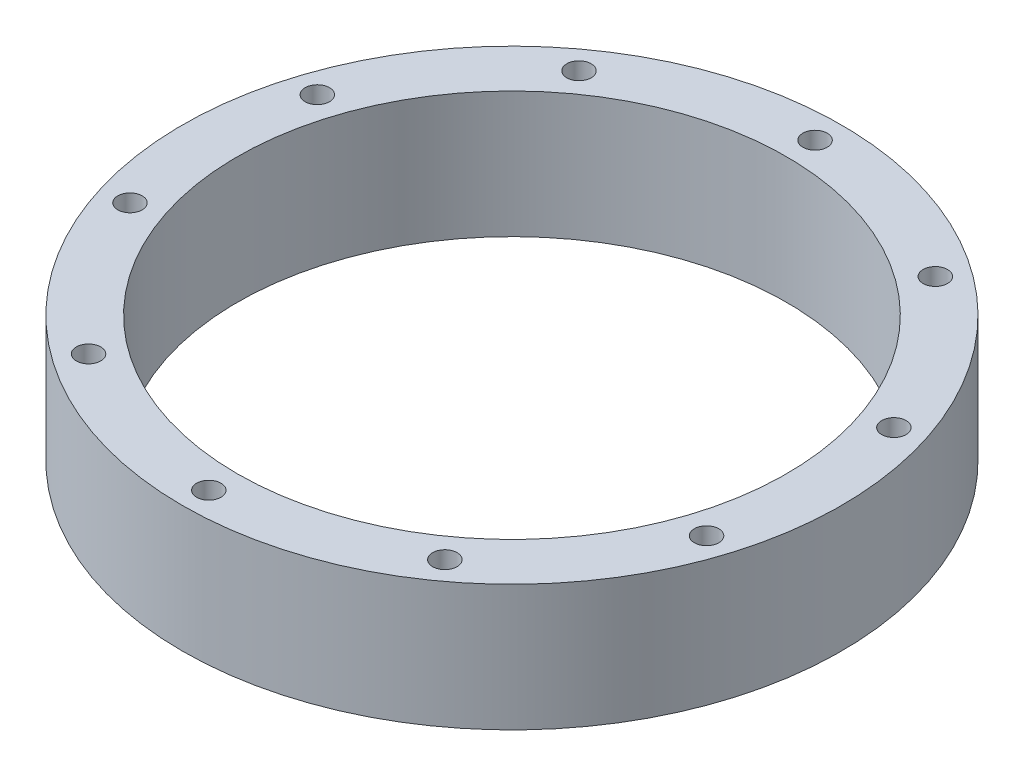
ISO-10303-21;
HEADER;
FILE_DESCRIPTION(('STEP AP214'),'2;1');
FILE_NAME('part.step','',(''),(''),'','','');
FILE_SCHEMA(('AUTOMOTIVE_DESIGN { 1 0 10303 214 1 1 1 1 }'));
ENDSEC;
DATA;
#1=APPLICATION_CONTEXT('core data for automotive mechanical design processes');
#2=APPLICATION_PROTOCOL_DEFINITION('international standard','automotive_design',2000,#1);
#3=PRODUCT_CONTEXT('',#1,'mechanical');
#4=PRODUCT('Part','Part','',(#3));
#5=PRODUCT_RELATED_PRODUCT_CATEGORY('part','',(#4));
#6=PRODUCT_DEFINITION_FORMATION('','',#4);
#7=PRODUCT_DEFINITION_CONTEXT('part definition',#1,'design');
#8=PRODUCT_DEFINITION('design','',#6,#7);
#9=PRODUCT_DEFINITION_SHAPE('','',#8);
#10=(LENGTH_UNIT() NAMED_UNIT(*) SI_UNIT(.MILLI.,.METRE.));
#11=(NAMED_UNIT(*) PLANE_ANGLE_UNIT() SI_UNIT($,.RADIAN.));
#12=(NAMED_UNIT(*) SI_UNIT($,.STERADIAN.) SOLID_ANGLE_UNIT());
#13=UNCERTAINTY_MEASURE_WITH_UNIT(LENGTH_MEASURE(1.E-05),#10,'distance_accuracy_value','');
#14=(GEOMETRIC_REPRESENTATION_CONTEXT(3) GLOBAL_UNCERTAINTY_ASSIGNED_CONTEXT((#13)) GLOBAL_UNIT_ASSIGNED_CONTEXT((#10,
#11,#12)) REPRESENTATION_CONTEXT('',''));
#15=CARTESIAN_POINT('',(0.,0.,0.));
#16=DIRECTION('',(0.,0.,1.));
#17=DIRECTION('',(1.,0.,0.));
#18=AXIS2_PLACEMENT_3D('',#15,#16,#17);
#19=CARTESIAN_POINT('',(0.,15.5,0.));
#20=DIRECTION('',(0.,1.,0.));
#21=DIRECTION('',(0.,0.,1.));
#22=AXIS2_PLACEMENT_3D('',#19,#20,#21);
#23=PLANE('',#22);
#24=CARTESIAN_POINT('',(-21.8950006478949,15.5,-30.1358830404666));
#25=DIRECTION('',(0.,1.,0.));
#26=DIRECTION('',(0.,0.,1.));
#27=AXIS2_PLACEMENT_3D('',#24,#25,#26);
#28=CIRCLE('',#27,1.50000000000077);
#29=CARTESIAN_POINT('',(-21.8950006478949,15.5,-28.6358830404658));
#30=VERTEX_POINT('',#29);
#31=EDGE_CURVE('E99',#30,#30,#28,.T.);
#32=ORIENTED_EDGE('',*,*,#31,.F.);
#33=EDGE_LOOP('',(#32));
#34=FACE_BOUND('',#33,.T.);
#35=CARTESIAN_POINT('',(-35.4268552319947,15.5,11.5108830404676));
#36=DIRECTION('',(0.,1.,0.));
#37=DIRECTION('',(0.,0.,1.));
#38=AXIS2_PLACEMENT_3D('',#35,#36,#37);
#39=CIRCLE('',#38,1.50000000000084);
#40=CARTESIAN_POINT('',(-35.4268552319947,15.5,13.0108830404684));
#41=VERTEX_POINT('',#40);
#42=EDGE_CURVE('E87',#41,#41,#39,.T.);
#43=ORIENTED_EDGE('',*,*,#42,.F.);
#44=EDGE_LOOP('',(#43));
#45=FACE_BOUND('',#44,.T.);
#46=CARTESIAN_POINT('',(0.,15.5,37.25));
#47=DIRECTION('',(0.,1.,0.));
#48=DIRECTION('',(0.,0.,1.));
#49=AXIS2_PLACEMENT_3D('',#46,#47,#48);
#50=CIRCLE('',#49,1.50000000000025);
#51=CARTESIAN_POINT('',(0.,15.5,38.7500000000002));
#52=VERTEX_POINT('',#51);
#53=EDGE_CURVE('E75',#52,#52,#50,.T.);
#54=ORIENTED_EDGE('',*,*,#53,.F.);
#55=EDGE_LOOP('',(#54));
#56=FACE_BOUND('',#55,.T.);
#57=CARTESIAN_POINT('',(35.4268552319951,15.5,11.5108830404673));
#58=DIRECTION('',(0.,1.,0.));
#59=DIRECTION('',(0.,0.,1.));
#60=AXIS2_PLACEMENT_3D('',#57,#58,#59);
#61=CIRCLE('',#60,1.49999999999969);
#62=CARTESIAN_POINT('',(35.4268552319951,15.5,13.010883040467));
#63=VERTEX_POINT('',#62);
#64=EDGE_CURVE('E63',#63,#63,#61,.T.);
#65=ORIENTED_EDGE('',*,*,#64,.F.);
#66=EDGE_LOOP('',(#65));
#67=FACE_BOUND('',#66,.T.);
#68=CARTESIAN_POINT('',(21.8950006478949,15.5,-30.1358830404668));
#69=DIRECTION('',(0.,1.,0.));
#70=DIRECTION('',(0.,0.,1.));
#71=AXIS2_PLACEMENT_3D('',#68,#69,#70);
#72=CIRCLE('',#71,1.49999999999974);
#73=CARTESIAN_POINT('',(21.8950006478949,15.5,-28.635883040467));
#74=VERTEX_POINT('',#73);
#75=EDGE_CURVE('E51',#74,#74,#72,.T.);
#76=ORIENTED_EDGE('',*,*,#75,.F.);
#77=EDGE_LOOP('',(#76));
#78=FACE_BOUND('',#77,.T.);
#79=CARTESIAN_POINT('',(0.,15.5,0.));
#80=DIRECTION('',(0.,1.,0.));
#81=DIRECTION('',(0.,0.,1.));
#82=AXIS2_PLACEMENT_3D('',#79,#80,#81);
#83=CIRCLE('',#82,40.5);
#84=CARTESIAN_POINT('',(0.,15.5,40.5));
#85=VERTEX_POINT('',#84);
#86=EDGE_CURVE('E10',#85,#85,#83,.T.);
#87=ORIENTED_EDGE('',*,*,#86,.T.);
#88=EDGE_LOOP('',(#87));
#89=FACE_BOUND('',#88,.T.);
#90=CARTESIAN_POINT('',(0.,15.5,-37.25));
#91=DIRECTION('',(0.,1.,0.));
#92=DIRECTION('',(0.,0.,1.));
#93=AXIS2_PLACEMENT_3D('',#90,#91,#92);
#94=CIRCLE('',#93,1.5);
#95=CARTESIAN_POINT('',(0.,15.5,-35.75));
#96=VERTEX_POINT('',#95);
#97=EDGE_CURVE('E46',#96,#96,#94,.T.);
#98=ORIENTED_EDGE('',*,*,#97,.F.);
#99=EDGE_LOOP('',(#98));
#100=FACE_BOUND('',#99,.T.);
#101=CARTESIAN_POINT('',(35.426855231995,15.5,-11.5108830404666));
#102=DIRECTION('',(0.,1.,0.));
#103=DIRECTION('',(0.,0.,1.));
#104=AXIS2_PLACEMENT_3D('',#101,#102,#103);
#105=CIRCLE('',#104,1.49999999999962);
#106=CARTESIAN_POINT('',(35.426855231995,15.5,-10.010883040467));
#107=VERTEX_POINT('',#106);
#108=EDGE_CURVE('E57',#107,#107,#105,.T.);
#109=ORIENTED_EDGE('',*,*,#108,.F.);
#110=EDGE_LOOP('',(#109));
#111=FACE_BOUND('',#110,.T.);
#112=CARTESIAN_POINT('',(21.8950006478946,15.5,30.1358830404668));
#113=DIRECTION('',(0.,1.,0.));
#114=DIRECTION('',(0.,0.,1.));
#115=AXIS2_PLACEMENT_3D('',#112,#113,#114);
#116=CIRCLE('',#115,1.50000000000021);
#117=CARTESIAN_POINT('',(21.8950006478946,15.5,31.635883040467));
#118=VERTEX_POINT('',#117);
#119=EDGE_CURVE('E69',#118,#118,#116,.T.);
#120=ORIENTED_EDGE('',*,*,#119,.F.);
#121=EDGE_LOOP('',(#120));
#122=FACE_BOUND('',#121,.T.);
#123=CARTESIAN_POINT('',(-21.8950006478946,15.5,30.1358830404668));
#124=DIRECTION('',(0.,1.,0.));
#125=DIRECTION('',(0.,0.,1.));
#126=AXIS2_PLACEMENT_3D('',#123,#124,#125);
#127=CIRCLE('',#126,1.50000000000032);
#128=CARTESIAN_POINT('',(-21.8950006478946,15.5,31.6358830404671));
#129=VERTEX_POINT('',#128);
#130=EDGE_CURVE('E81',#129,#129,#127,.T.);
#131=ORIENTED_EDGE('',*,*,#130,.F.);
#132=EDGE_LOOP('',(#131));
#133=FACE_BOUND('',#132,.T.);
#134=CARTESIAN_POINT('',(-35.4268552319948,15.5,-11.5108830404663));
#135=DIRECTION('',(0.,1.,0.));
#136=DIRECTION('',(0.,0.,1.));
#137=AXIS2_PLACEMENT_3D('',#134,#135,#136);
#138=CIRCLE('',#137,1.5000000000009);
#139=CARTESIAN_POINT('',(-35.4268552319948,15.5,-10.0108830404654));
#140=VERTEX_POINT('',#139);
#141=EDGE_CURVE('E93',#140,#140,#138,.T.);
#142=ORIENTED_EDGE('',*,*,#141,.F.);
#143=EDGE_LOOP('',(#142));
#144=FACE_BOUND('',#143,.T.);
#145=CARTESIAN_POINT('',(0.,15.5,0.));
#146=DIRECTION('',(0.,1.,0.));
#147=DIRECTION('',(0.,0.,1.));
#148=AXIS2_PLACEMENT_3D('',#145,#146,#147);
#149=CIRCLE('',#148,33.75);
#150=CARTESIAN_POINT('',(0.,15.5,33.75));
#151=VERTEX_POINT('',#150);
#152=EDGE_CURVE('E105',#151,#151,#149,.T.);
#153=ORIENTED_EDGE('',*,*,#152,.F.);
#154=EDGE_LOOP('',(#153));
#155=FACE_BOUND('',#154,.T.);
#156=ADVANCED_FACE('F35',(#34,#45,#56,#67,#78,#89,#100,#111,#122,#133,#144,#155),#23,.T.);
#157=CARTESIAN_POINT('',(0.,0.,0.));
#158=DIRECTION('',(0.,1.,0.));
#159=DIRECTION('',(0.,0.,1.));
#160=AXIS2_PLACEMENT_3D('',#157,#158,#159);
#161=PLANE('',#160);
#162=CARTESIAN_POINT('',(0.,0.,0.));
#163=DIRECTION('',(0.,1.,0.));
#164=DIRECTION('',(0.,0.,1.));
#165=AXIS2_PLACEMENT_3D('',#162,#163,#164);
#166=CIRCLE('',#165,40.5);
#167=CARTESIAN_POINT('',(0.,0.,40.5));
#168=VERTEX_POINT('',#167);
#169=EDGE_CURVE('E39',#168,#168,#166,.T.);
#170=ORIENTED_EDGE('',*,*,#169,.F.);
#171=EDGE_LOOP('',(#170));
#172=FACE_BOUND('',#171,.T.);
#173=CARTESIAN_POINT('',(0.,0.,-37.25));
#174=DIRECTION('',(0.,1.,0.));
#175=DIRECTION('',(0.,0.,1.));
#176=AXIS2_PLACEMENT_3D('',#173,#174,#175);
#177=CIRCLE('',#176,1.5);
#178=CARTESIAN_POINT('',(0.,0.,-35.75));
#179=VERTEX_POINT('',#178);
#180=EDGE_CURVE('E48',#179,#179,#177,.T.);
#181=ORIENTED_EDGE('',*,*,#180,.T.);
#182=EDGE_LOOP('',(#181));
#183=FACE_BOUND('',#182,.T.);
#184=CARTESIAN_POINT('',(21.8950006478949,0.,-30.1358830404668));
#185=DIRECTION('',(0.,1.,0.));
#186=DIRECTION('',(0.,0.,1.));
#187=AXIS2_PLACEMENT_3D('',#184,#185,#186);
#188=CIRCLE('',#187,1.49999999999974);
#189=CARTESIAN_POINT('',(21.8950006478949,0.,-28.635883040467));
#190=VERTEX_POINT('',#189);
#191=EDGE_CURVE('E54',#190,#190,#188,.T.);
#192=ORIENTED_EDGE('',*,*,#191,.T.);
#193=EDGE_LOOP('',(#192));
#194=FACE_BOUND('',#193,.T.);
#195=CARTESIAN_POINT('',(35.426855231995,0.,-11.5108830404666));
#196=DIRECTION('',(0.,1.,0.));
#197=DIRECTION('',(0.,0.,1.));
#198=AXIS2_PLACEMENT_3D('',#195,#196,#197);
#199=CIRCLE('',#198,1.49999999999962);
#200=CARTESIAN_POINT('',(35.426855231995,0.,-10.010883040467));
#201=VERTEX_POINT('',#200);
#202=EDGE_CURVE('E60',#201,#201,#199,.T.);
#203=ORIENTED_EDGE('',*,*,#202,.T.);
#204=EDGE_LOOP('',(#203));
#205=FACE_BOUND('',#204,.T.);
#206=CARTESIAN_POINT('',(35.4268552319951,0.,11.5108830404673));
#207=DIRECTION('',(0.,1.,0.));
#208=DIRECTION('',(0.,0.,1.));
#209=AXIS2_PLACEMENT_3D('',#206,#207,#208);
#210=CIRCLE('',#209,1.49999999999969);
#211=CARTESIAN_POINT('',(35.4268552319951,0.,13.010883040467));
#212=VERTEX_POINT('',#211);
#213=EDGE_CURVE('E66',#212,#212,#210,.T.);
#214=ORIENTED_EDGE('',*,*,#213,.T.);
#215=EDGE_LOOP('',(#214));
#216=FACE_BOUND('',#215,.T.);
#217=CARTESIAN_POINT('',(21.8950006478946,0.,30.1358830404668));
#218=DIRECTION('',(0.,1.,0.));
#219=DIRECTION('',(0.,0.,1.));
#220=AXIS2_PLACEMENT_3D('',#217,#218,#219);
#221=CIRCLE('',#220,1.50000000000021);
#222=CARTESIAN_POINT('',(21.8950006478946,0.,31.635883040467));
#223=VERTEX_POINT('',#222);
#224=EDGE_CURVE('E72',#223,#223,#221,.T.);
#225=ORIENTED_EDGE('',*,*,#224,.T.);
#226=EDGE_LOOP('',(#225));
#227=FACE_BOUND('',#226,.T.);
#228=CARTESIAN_POINT('',(0.,0.,37.25));
#229=DIRECTION('',(0.,1.,0.));
#230=DIRECTION('',(0.,0.,1.));
#231=AXIS2_PLACEMENT_3D('',#228,#229,#230);
#232=CIRCLE('',#231,1.50000000000025);
#233=CARTESIAN_POINT('',(0.,0.,38.7500000000002));
#234=VERTEX_POINT('',#233);
#235=EDGE_CURVE('E78',#234,#234,#232,.T.);
#236=ORIENTED_EDGE('',*,*,#235,.T.);
#237=EDGE_LOOP('',(#236));
#238=FACE_BOUND('',#237,.T.);
#239=CARTESIAN_POINT('',(-21.8950006478946,0.,30.1358830404668));
#240=DIRECTION('',(0.,1.,0.));
#241=DIRECTION('',(0.,0.,1.));
#242=AXIS2_PLACEMENT_3D('',#239,#240,#241);
#243=CIRCLE('',#242,1.50000000000032);
#244=CARTESIAN_POINT('',(-21.8950006478946,0.,31.6358830404671));
#245=VERTEX_POINT('',#244);
#246=EDGE_CURVE('E84',#245,#245,#243,.T.);
#247=ORIENTED_EDGE('',*,*,#246,.T.);
#248=EDGE_LOOP('',(#247));
#249=FACE_BOUND('',#248,.T.);
#250=CARTESIAN_POINT('',(-35.4268552319947,0.,11.5108830404676));
#251=DIRECTION('',(0.,1.,0.));
#252=DIRECTION('',(0.,0.,1.));
#253=AXIS2_PLACEMENT_3D('',#250,#251,#252);
#254=CIRCLE('',#253,1.50000000000084);
#255=CARTESIAN_POINT('',(-35.4268552319947,0.,13.0108830404684));
#256=VERTEX_POINT('',#255);
#257=EDGE_CURVE('E90',#256,#256,#254,.T.);
#258=ORIENTED_EDGE('',*,*,#257,.T.);
#259=EDGE_LOOP('',(#258));
#260=FACE_BOUND('',#259,.T.);
#261=CARTESIAN_POINT('',(-35.4268552319948,0.,-11.5108830404663));
#262=DIRECTION('',(0.,1.,0.));
#263=DIRECTION('',(0.,0.,1.));
#264=AXIS2_PLACEMENT_3D('',#261,#262,#263);
#265=CIRCLE('',#264,1.5000000000009);
#266=CARTESIAN_POINT('',(-35.4268552319948,0.,-10.0108830404654));
#267=VERTEX_POINT('',#266);
#268=EDGE_CURVE('E96',#267,#267,#265,.T.);
#269=ORIENTED_EDGE('',*,*,#268,.T.);
#270=EDGE_LOOP('',(#269));
#271=FACE_BOUND('',#270,.T.);
#272=CARTESIAN_POINT('',(-21.8950006478949,0.,-30.1358830404666));
#273=DIRECTION('',(0.,1.,0.));
#274=DIRECTION('',(0.,0.,1.));
#275=AXIS2_PLACEMENT_3D('',#272,#273,#274);
#276=CIRCLE('',#275,1.50000000000077);
#277=CARTESIAN_POINT('',(-21.8950006478949,0.,-28.6358830404658));
#278=VERTEX_POINT('',#277);
#279=EDGE_CURVE('E102',#278,#278,#276,.T.);
#280=ORIENTED_EDGE('',*,*,#279,.T.);
#281=EDGE_LOOP('',(#280));
#282=FACE_BOUND('',#281,.T.);
#283=CARTESIAN_POINT('',(0.,0.,0.));
#284=DIRECTION('',(0.,1.,0.));
#285=DIRECTION('',(0.,0.,1.));
#286=AXIS2_PLACEMENT_3D('',#283,#284,#285);
#287=CIRCLE('',#286,33.75);
#288=CARTESIAN_POINT('',(0.,0.,33.75));
#289=VERTEX_POINT('',#288);
#290=EDGE_CURVE('E108',#289,#289,#287,.T.);
#291=ORIENTED_EDGE('',*,*,#290,.T.);
#292=EDGE_LOOP('',(#291));
#293=FACE_BOUND('',#292,.T.);
#294=ADVANCED_FACE('F118',(#172,#183,#194,#205,#216,#227,#238,#249,#260,#271,#282,#293),#161,.F.);
#295=CARTESIAN_POINT('',(0.,15.5,0.));
#296=DIRECTION('',(0.,-1.,0.));
#297=DIRECTION('',(0.,0.,-1.));
#298=AXIS2_PLACEMENT_3D('',#295,#296,#297);
#299=CYLINDRICAL_SURFACE('',#298,40.5);
#300=ORIENTED_EDGE('',*,*,#86,.F.);
#301=EDGE_LOOP('',(#300));
#302=FACE_BOUND('',#301,.T.);
#303=ORIENTED_EDGE('',*,*,#169,.T.);
#304=EDGE_LOOP('',(#303));
#305=FACE_BOUND('',#304,.T.);
#306=ADVANCED_FACE('F37',(#302,#305),#299,.T.);
#307=CARTESIAN_POINT('',(0.,15.5,-37.25));
#308=DIRECTION('',(0.,-1.,0.));
#309=DIRECTION('',(0.,0.,-1.));
#310=AXIS2_PLACEMENT_3D('',#307,#308,#309);
#311=CYLINDRICAL_SURFACE('',#310,1.5);
#312=ORIENTED_EDGE('',*,*,#97,.T.);
#313=EDGE_LOOP('',(#312));
#314=FACE_BOUND('',#313,.T.);
#315=ORIENTED_EDGE('',*,*,#180,.F.);
#316=EDGE_LOOP('',(#315));
#317=FACE_BOUND('',#316,.T.);
#318=ADVANCED_FACE('F128',(#314,#317),#311,.F.);
#319=CARTESIAN_POINT('',(21.8950006478949,15.5,-30.1358830404668));
#320=DIRECTION('',(0.,-1.,0.));
#321=DIRECTION('',(0.,0.,-1.));
#322=AXIS2_PLACEMENT_3D('',#319,#320,#321);
#323=CYLINDRICAL_SURFACE('',#322,1.49999999999974);
#324=ORIENTED_EDGE('',*,*,#75,.T.);
#325=EDGE_LOOP('',(#324));
#326=FACE_BOUND('',#325,.T.);
#327=ORIENTED_EDGE('',*,*,#191,.F.);
#328=EDGE_LOOP('',(#327));
#329=FACE_BOUND('',#328,.T.);
#330=ADVANCED_FACE('F131',(#326,#329),#323,.F.);
#331=CARTESIAN_POINT('',(35.426855231995,15.5,-11.5108830404666));
#332=DIRECTION('',(0.,-1.,0.));
#333=DIRECTION('',(0.,0.,-1.));
#334=AXIS2_PLACEMENT_3D('',#331,#332,#333);
#335=CYLINDRICAL_SURFACE('',#334,1.49999999999962);
#336=ORIENTED_EDGE('',*,*,#108,.T.);
#337=EDGE_LOOP('',(#336));
#338=FACE_BOUND('',#337,.T.);
#339=ORIENTED_EDGE('',*,*,#202,.F.);
#340=EDGE_LOOP('',(#339));
#341=FACE_BOUND('',#340,.T.);
#342=ADVANCED_FACE('F135',(#338,#341),#335,.F.);
#343=CARTESIAN_POINT('',(35.4268552319951,15.5,11.5108830404673));
#344=DIRECTION('',(0.,-1.,0.));
#345=DIRECTION('',(0.,0.,-1.));
#346=AXIS2_PLACEMENT_3D('',#343,#344,#345);
#347=CYLINDRICAL_SURFACE('',#346,1.49999999999969);
#348=ORIENTED_EDGE('',*,*,#64,.T.);
#349=EDGE_LOOP('',(#348));
#350=FACE_BOUND('',#349,.T.);
#351=ORIENTED_EDGE('',*,*,#213,.F.);
#352=EDGE_LOOP('',(#351));
#353=FACE_BOUND('',#352,.T.);
#354=ADVANCED_FACE('F139',(#350,#353),#347,.F.);
#355=CARTESIAN_POINT('',(21.8950006478946,15.5,30.1358830404668));
#356=DIRECTION('',(0.,-1.,0.));
#357=DIRECTION('',(0.,0.,-1.));
#358=AXIS2_PLACEMENT_3D('',#355,#356,#357);
#359=CYLINDRICAL_SURFACE('',#358,1.50000000000021);
#360=ORIENTED_EDGE('',*,*,#119,.T.);
#361=EDGE_LOOP('',(#360));
#362=FACE_BOUND('',#361,.T.);
#363=ORIENTED_EDGE('',*,*,#224,.F.);
#364=EDGE_LOOP('',(#363));
#365=FACE_BOUND('',#364,.T.);
#366=ADVANCED_FACE('F143',(#362,#365),#359,.F.);
#367=CARTESIAN_POINT('',(0.,15.5,37.25));
#368=DIRECTION('',(0.,-1.,0.));
#369=DIRECTION('',(0.,0.,-1.));
#370=AXIS2_PLACEMENT_3D('',#367,#368,#369);
#371=CYLINDRICAL_SURFACE('',#370,1.50000000000025);
#372=ORIENTED_EDGE('',*,*,#53,.T.);
#373=EDGE_LOOP('',(#372));
#374=FACE_BOUND('',#373,.T.);
#375=ORIENTED_EDGE('',*,*,#235,.F.);
#376=EDGE_LOOP('',(#375));
#377=FACE_BOUND('',#376,.T.);
#378=ADVANCED_FACE('F147',(#374,#377),#371,.F.);
#379=CARTESIAN_POINT('',(-21.8950006478946,15.5,30.1358830404668));
#380=DIRECTION('',(0.,-1.,0.));
#381=DIRECTION('',(0.,0.,-1.));
#382=AXIS2_PLACEMENT_3D('',#379,#380,#381);
#383=CYLINDRICAL_SURFACE('',#382,1.50000000000032);
#384=ORIENTED_EDGE('',*,*,#130,.T.);
#385=EDGE_LOOP('',(#384));
#386=FACE_BOUND('',#385,.T.);
#387=ORIENTED_EDGE('',*,*,#246,.F.);
#388=EDGE_LOOP('',(#387));
#389=FACE_BOUND('',#388,.T.);
#390=ADVANCED_FACE('F151',(#386,#389),#383,.F.);
#391=CARTESIAN_POINT('',(-35.4268552319947,15.5,11.5108830404676));
#392=DIRECTION('',(0.,-1.,0.));
#393=DIRECTION('',(0.,0.,-1.));
#394=AXIS2_PLACEMENT_3D('',#391,#392,#393);
#395=CYLINDRICAL_SURFACE('',#394,1.50000000000084);
#396=ORIENTED_EDGE('',*,*,#42,.T.);
#397=EDGE_LOOP('',(#396));
#398=FACE_BOUND('',#397,.T.);
#399=ORIENTED_EDGE('',*,*,#257,.F.);
#400=EDGE_LOOP('',(#399));
#401=FACE_BOUND('',#400,.T.);
#402=ADVANCED_FACE('F155',(#398,#401),#395,.F.);
#403=CARTESIAN_POINT('',(-35.4268552319948,15.5,-11.5108830404663));
#404=DIRECTION('',(0.,-1.,0.));
#405=DIRECTION('',(0.,0.,-1.));
#406=AXIS2_PLACEMENT_3D('',#403,#404,#405);
#407=CYLINDRICAL_SURFACE('',#406,1.5000000000009);
#408=ORIENTED_EDGE('',*,*,#141,.T.);
#409=EDGE_LOOP('',(#408));
#410=FACE_BOUND('',#409,.T.);
#411=ORIENTED_EDGE('',*,*,#268,.F.);
#412=EDGE_LOOP('',(#411));
#413=FACE_BOUND('',#412,.T.);
#414=ADVANCED_FACE('F159',(#410,#413),#407,.F.);
#415=CARTESIAN_POINT('',(-21.8950006478949,15.5,-30.1358830404666));
#416=DIRECTION('',(0.,-1.,0.));
#417=DIRECTION('',(0.,0.,-1.));
#418=AXIS2_PLACEMENT_3D('',#415,#416,#417);
#419=CYLINDRICAL_SURFACE('',#418,1.50000000000077);
#420=ORIENTED_EDGE('',*,*,#31,.T.);
#421=EDGE_LOOP('',(#420));
#422=FACE_BOUND('',#421,.T.);
#423=ORIENTED_EDGE('',*,*,#279,.F.);
#424=EDGE_LOOP('',(#423));
#425=FACE_BOUND('',#424,.T.);
#426=ADVANCED_FACE('F163',(#422,#425),#419,.F.);
#427=CARTESIAN_POINT('',(0.,15.5,0.));
#428=DIRECTION('',(0.,-1.,0.));
#429=DIRECTION('',(0.,0.,-1.));
#430=AXIS2_PLACEMENT_3D('',#427,#428,#429);
#431=CYLINDRICAL_SURFACE('',#430,33.75);
#432=ORIENTED_EDGE('',*,*,#152,.T.);
#433=EDGE_LOOP('',(#432));
#434=FACE_BOUND('',#433,.T.);
#435=ORIENTED_EDGE('',*,*,#290,.F.);
#436=EDGE_LOOP('',(#435));
#437=FACE_BOUND('',#436,.T.);
#438=ADVANCED_FACE('F114',(#434,#437),#431,.F.);
#439=CLOSED_SHELL('',(#156,#294,#306,#318,#330,#342,#354,#366,#378,#390,#402,#414,#426,#438));
#440=MANIFOLD_SOLID_BREP('B2',#439);
#441=ADVANCED_BREP_SHAPE_REPRESENTATION('',(#18,#440),#14);
#442=SHAPE_DEFINITION_REPRESENTATION(#9,#441);
ENDSEC;
END-ISO-10303-21;
